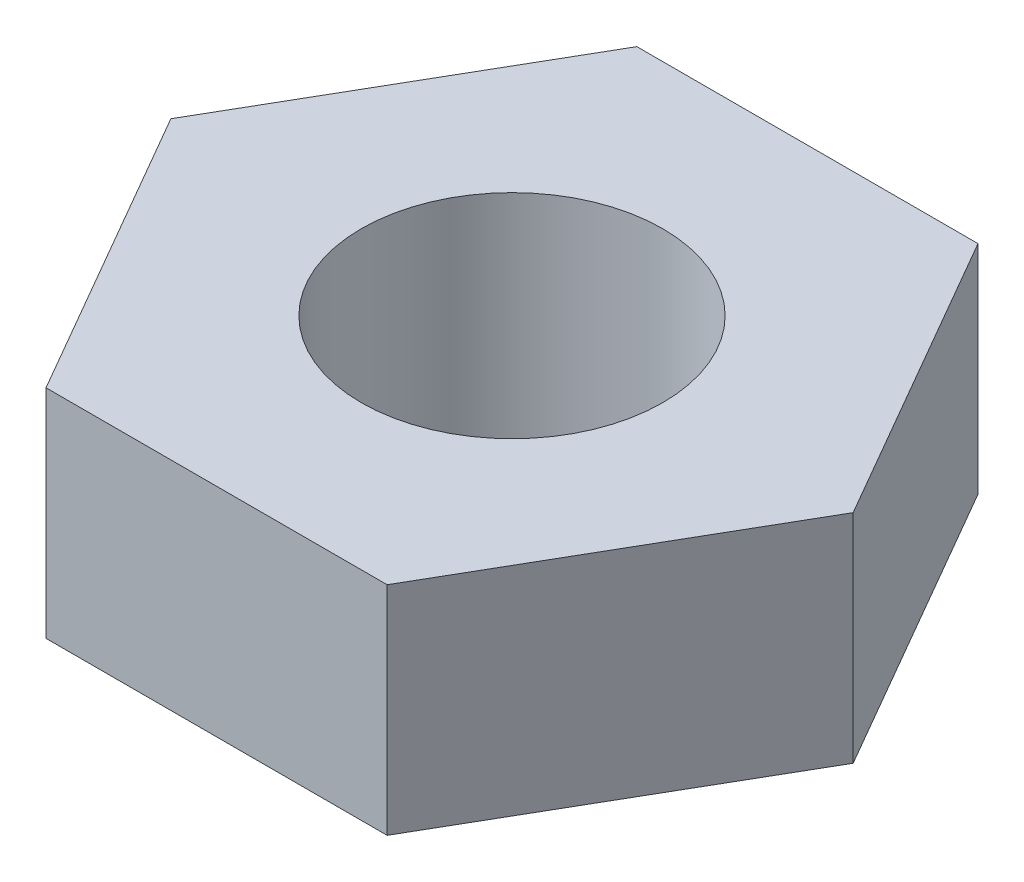
ISO-10303-21;
HEADER;
FILE_DESCRIPTION(('STEP AP214'),'2;1');
FILE_NAME('part.step','',(''),(''),'','','');
FILE_SCHEMA(('AUTOMOTIVE_DESIGN { 1 0 10303 214 1 1 1 1 }'));
ENDSEC;
DATA;
#1=APPLICATION_CONTEXT('core data for automotive mechanical design processes');
#2=APPLICATION_PROTOCOL_DEFINITION('international standard','automotive_design',2000,#1);
#3=PRODUCT_CONTEXT('',#1,'mechanical');
#4=PRODUCT('Part','Part','',(#3));
#5=PRODUCT_RELATED_PRODUCT_CATEGORY('part','',(#4));
#6=PRODUCT_DEFINITION_FORMATION('','',#4);
#7=PRODUCT_DEFINITION_CONTEXT('part definition',#1,'design');
#8=PRODUCT_DEFINITION('design','',#6,#7);
#9=PRODUCT_DEFINITION_SHAPE('','',#8);
#10=(LENGTH_UNIT() NAMED_UNIT(*) SI_UNIT(.MILLI.,.METRE.));
#11=(NAMED_UNIT(*) PLANE_ANGLE_UNIT() SI_UNIT($,.RADIAN.));
#12=(NAMED_UNIT(*) SI_UNIT($,.STERADIAN.) SOLID_ANGLE_UNIT());
#13=UNCERTAINTY_MEASURE_WITH_UNIT(LENGTH_MEASURE(1.E-05),#10,'distance_accuracy_value','');
#14=(GEOMETRIC_REPRESENTATION_CONTEXT(3) GLOBAL_UNCERTAINTY_ASSIGNED_CONTEXT((#13)) GLOBAL_UNIT_ASSIGNED_CONTEXT((#10,
#11,#12)) REPRESENTATION_CONTEXT('',''));
#15=CARTESIAN_POINT('',(0.,0.,0.));
#16=DIRECTION('',(0.,0.,1.));
#17=DIRECTION('',(1.,0.,0.));
#18=AXIS2_PLACEMENT_3D('',#15,#16,#17);
#19=CARTESIAN_POINT('',(0.,1.8,2.45));
#20=DIRECTION('',(0.,0.,-1.));
#21=DIRECTION('',(-1.,0.,0.));
#22=AXIS2_PLACEMENT_3D('',#19,#20,#21);
#23=PLANE('',#22);
#24=DIRECTION('',(1.,0.,0.));
#25=VECTOR('',#24,1.);
#26=CARTESIAN_POINT('',(0.,0.,2.45));
#27=LINE('',#26,#25);
#28=CARTESIAN_POINT('',(-1.41450815951458,0.,2.45));
#29=VERTEX_POINT('',#28);
#30=CARTESIAN_POINT('',(1.41450815951458,0.,2.45));
#31=VERTEX_POINT('',#30);
#32=EDGE_CURVE('E129',#29,#31,#27,.T.);
#33=ORIENTED_EDGE('',*,*,#32,.T.);
#34=DIRECTION('',(0.,-1.,0.));
#35=VECTOR('',#34,1.);
#36=CARTESIAN_POINT('',(1.41450815951458,1.8,2.45));
#37=LINE('',#36,#35);
#38=CARTESIAN_POINT('',(1.41450815951458,1.8,2.45));
#39=VERTEX_POINT('',#38);
#40=EDGE_CURVE('E11',#39,#31,#37,.T.);
#41=ORIENTED_EDGE('',*,*,#40,.F.);
#42=DIRECTION('',(1.,0.,0.));
#43=VECTOR('',#42,1.);
#44=CARTESIAN_POINT('',(0.,1.8,2.45));
#45=LINE('',#44,#43);
#46=CARTESIAN_POINT('',(-1.41450815951458,1.8,2.45));
#47=VERTEX_POINT('',#46);
#48=EDGE_CURVE('E152',#47,#39,#45,.T.);
#49=ORIENTED_EDGE('',*,*,#48,.F.);
#50=DIRECTION('',(0.,-1.,0.));
#51=VECTOR('',#50,1.);
#52=CARTESIAN_POINT('',(-1.41450815951458,1.8,2.45));
#53=LINE('',#52,#51);
#54=EDGE_CURVE('E122',#47,#29,#53,.T.);
#55=ORIENTED_EDGE('',*,*,#54,.T.);
#56=EDGE_LOOP('',(#33,#41,#49,#55));
#57=FACE_BOUND('',#56,.T.);
#58=ADVANCED_FACE('F41',(#57),#23,.F.);
#59=CARTESIAN_POINT('',(2.12176223927188,1.8,1.225));
#60=DIRECTION('',(-0.866025403784438,0.,-0.5));
#61=DIRECTION('',(-0.5,0.,0.866025403784439));
#62=AXIS2_PLACEMENT_3D('',#59,#60,#61);
#63=PLANE('',#62);
#64=DIRECTION('',(0.5,0.,-0.866025403784439));
#65=VECTOR('',#64,1.);
#66=CARTESIAN_POINT('',(2.12176223927188,0.,1.225));
#67=LINE('',#66,#65);
#68=CARTESIAN_POINT('',(2.82901631902917,0.,0.));
#69=VERTEX_POINT('',#68);
#70=EDGE_CURVE('E132',#31,#69,#67,.T.);
#71=ORIENTED_EDGE('',*,*,#70,.T.);
#72=DIRECTION('',(0.,-1.,0.));
#73=VECTOR('',#72,1.);
#74=CARTESIAN_POINT('',(2.82901631902917,1.8,0.));
#75=LINE('',#74,#73);
#76=CARTESIAN_POINT('',(2.82901631902917,1.8,0.));
#77=VERTEX_POINT('',#76);
#78=EDGE_CURVE('E50',#77,#69,#75,.T.);
#79=ORIENTED_EDGE('',*,*,#78,.F.);
#80=DIRECTION('',(0.5,0.,-0.866025403784439));
#81=VECTOR('',#80,1.);
#82=CARTESIAN_POINT('',(2.12176223927188,1.8,1.225));
#83=LINE('',#82,#81);
#84=EDGE_CURVE('E95',#39,#77,#83,.T.);
#85=ORIENTED_EDGE('',*,*,#84,.F.);
#86=ORIENTED_EDGE('',*,*,#40,.T.);
#87=EDGE_LOOP('',(#71,#79,#85,#86));
#88=FACE_BOUND('',#87,.T.);
#89=ADVANCED_FACE('F166',(#88),#63,.F.);
#90=CARTESIAN_POINT('',(2.12176223927188,1.8,-1.225));
#91=DIRECTION('',(-0.866025403784439,0.,0.5));
#92=DIRECTION('',(0.5,0.,0.866025403784439));
#93=AXIS2_PLACEMENT_3D('',#90,#91,#92);
#94=PLANE('',#93);
#95=DIRECTION('',(-0.5,0.,-0.866025403784439));
#96=VECTOR('',#95,1.);
#97=CARTESIAN_POINT('',(2.12176223927188,0.,-1.225));
#98=LINE('',#97,#96);
#99=CARTESIAN_POINT('',(1.41450815951458,0.,-2.45));
#100=VERTEX_POINT('',#99);
#101=EDGE_CURVE('E134',#69,#100,#98,.T.);
#102=ORIENTED_EDGE('',*,*,#101,.T.);
#103=DIRECTION('',(0.,-1.,0.));
#104=VECTOR('',#103,1.);
#105=CARTESIAN_POINT('',(1.41450815951458,1.8,-2.45));
#106=LINE('',#105,#104);
#107=CARTESIAN_POINT('',(1.41450815951458,1.8,-2.45));
#108=VERTEX_POINT('',#107);
#109=EDGE_CURVE('E117',#108,#100,#106,.T.);
#110=ORIENTED_EDGE('',*,*,#109,.F.);
#111=DIRECTION('',(-0.5,0.,-0.866025403784439));
#112=VECTOR('',#111,1.);
#113=CARTESIAN_POINT('',(2.12176223927188,1.8,-1.225));
#114=LINE('',#113,#112);
#115=EDGE_CURVE('E108',#77,#108,#114,.T.);
#116=ORIENTED_EDGE('',*,*,#115,.F.);
#117=ORIENTED_EDGE('',*,*,#78,.T.);
#118=EDGE_LOOP('',(#102,#110,#116,#117));
#119=FACE_BOUND('',#118,.T.);
#120=ADVANCED_FACE('F145',(#119),#94,.F.);
#121=CARTESIAN_POINT('',(0.,1.8,-2.45));
#122=DIRECTION('',(0.,0.,1.));
#123=DIRECTION('',(1.,0.,0.));
#124=AXIS2_PLACEMENT_3D('',#121,#122,#123);
#125=PLANE('',#124);
#126=DIRECTION('',(-1.,0.,0.));
#127=VECTOR('',#126,1.);
#128=CARTESIAN_POINT('',(0.,0.,-2.45));
#129=LINE('',#128,#127);
#130=CARTESIAN_POINT('',(-1.41450815951458,0.,-2.45));
#131=VERTEX_POINT('',#130);
#132=EDGE_CURVE('E116',#100,#131,#129,.T.);
#133=ORIENTED_EDGE('',*,*,#132,.T.);
#134=DIRECTION('',(0.,-1.,0.));
#135=VECTOR('',#134,1.);
#136=CARTESIAN_POINT('',(-1.41450815951458,1.8,-2.45));
#137=LINE('',#136,#135);
#138=CARTESIAN_POINT('',(-1.41450815951458,1.8,-2.45));
#139=VERTEX_POINT('',#138);
#140=EDGE_CURVE('E113',#139,#131,#137,.T.);
#141=ORIENTED_EDGE('',*,*,#140,.F.);
#142=DIRECTION('',(-1.,0.,0.));
#143=VECTOR('',#142,1.);
#144=CARTESIAN_POINT('',(0.,1.8,-2.45));
#145=LINE('',#144,#143);
#146=EDGE_CURVE('E102',#108,#139,#145,.T.);
#147=ORIENTED_EDGE('',*,*,#146,.F.);
#148=ORIENTED_EDGE('',*,*,#109,.T.);
#149=EDGE_LOOP('',(#133,#141,#147,#148));
#150=FACE_BOUND('',#149,.T.);
#151=ADVANCED_FACE('F114',(#150),#125,.F.);
#152=CARTESIAN_POINT('',(-2.12176223927187,1.8,-1.225));
#153=DIRECTION('',(0.866025403784438,0.,0.5));
#154=DIRECTION('',(0.5,0.,-0.866025403784439));
#155=AXIS2_PLACEMENT_3D('',#152,#153,#154);
#156=PLANE('',#155);
#157=DIRECTION('',(-0.5,0.,0.866025403784439));
#158=VECTOR('',#157,1.);
#159=CARTESIAN_POINT('',(-2.12176223927187,0.,-1.225));
#160=LINE('',#159,#158);
#161=CARTESIAN_POINT('',(-2.82901631902917,0.,0.));
#162=VERTEX_POINT('',#161);
#163=EDGE_CURVE('E81',#131,#162,#160,.T.);
#164=ORIENTED_EDGE('',*,*,#163,.T.);
#165=DIRECTION('',(0.,-1.,0.));
#166=VECTOR('',#165,1.);
#167=CARTESIAN_POINT('',(-2.82901631902917,1.8,0.));
#168=LINE('',#167,#166);
#169=CARTESIAN_POINT('',(-2.82901631902917,1.8,0.));
#170=VERTEX_POINT('',#169);
#171=EDGE_CURVE('E118',#170,#162,#168,.T.);
#172=ORIENTED_EDGE('',*,*,#171,.F.);
#173=DIRECTION('',(-0.5,0.,0.866025403784439));
#174=VECTOR('',#173,1.);
#175=CARTESIAN_POINT('',(-2.12176223927187,1.8,-1.225));
#176=LINE('',#175,#174);
#177=EDGE_CURVE('E106',#139,#170,#176,.T.);
#178=ORIENTED_EDGE('',*,*,#177,.F.);
#179=ORIENTED_EDGE('',*,*,#140,.T.);
#180=EDGE_LOOP('',(#164,#172,#178,#179));
#181=FACE_BOUND('',#180,.T.);
#182=ADVANCED_FACE('F120',(#181),#156,.F.);
#183=CARTESIAN_POINT('',(0.,1.8,0.));
#184=DIRECTION('',(0.,-1.,0.));
#185=DIRECTION('',(0.,0.,-1.));
#186=AXIS2_PLACEMENT_3D('',#183,#184,#185);
#187=CYLINDRICAL_SURFACE('',#186,1.25);
#188=CARTESIAN_POINT('',(0.,1.8,0.));
#189=DIRECTION('',(0.,1.,0.));
#190=DIRECTION('',(0.,0.,1.));
#191=AXIS2_PLACEMENT_3D('',#188,#189,#190);
#192=CIRCLE('',#191,1.25);
#193=CARTESIAN_POINT('',(0.,1.8,1.25));
#194=VERTEX_POINT('',#193);
#195=EDGE_CURVE('E139',#194,#194,#192,.T.);
#196=ORIENTED_EDGE('',*,*,#195,.T.);
#197=EDGE_LOOP('',(#196));
#198=FACE_BOUND('',#197,.T.);
#199=CARTESIAN_POINT('',(0.,0.,0.));
#200=DIRECTION('',(0.,1.,0.));
#201=DIRECTION('',(0.,0.,1.));
#202=AXIS2_PLACEMENT_3D('',#199,#200,#201);
#203=CIRCLE('',#202,1.25);
#204=CARTESIAN_POINT('',(0.,0.,1.25));
#205=VERTEX_POINT('',#204);
#206=EDGE_CURVE('E126',#205,#205,#203,.T.);
#207=ORIENTED_EDGE('',*,*,#206,.F.);
#208=EDGE_LOOP('',(#207));
#209=FACE_BOUND('',#208,.T.);
#210=ADVANCED_FACE('F43',(#198,#209),#187,.F.);
#211=CARTESIAN_POINT('',(-2.12176223927188,1.8,1.225));
#212=DIRECTION('',(0.866025403784439,0.,-0.5));
#213=DIRECTION('',(-0.5,0.,-0.866025403784439));
#214=AXIS2_PLACEMENT_3D('',#211,#212,#213);
#215=PLANE('',#214);
#216=DIRECTION('',(0.5,0.,0.866025403784439));
#217=VECTOR('',#216,1.);
#218=CARTESIAN_POINT('',(-2.12176223927188,0.,1.225));
#219=LINE('',#218,#217);
#220=EDGE_CURVE('E87',#162,#29,#219,.T.);
#221=ORIENTED_EDGE('',*,*,#220,.T.);
#222=ORIENTED_EDGE('',*,*,#54,.F.);
#223=DIRECTION('',(0.5,0.,0.866025403784439));
#224=VECTOR('',#223,1.);
#225=CARTESIAN_POINT('',(-2.12176223927188,1.8,1.225));
#226=LINE('',#225,#224);
#227=EDGE_CURVE('E58',#170,#47,#226,.T.);
#228=ORIENTED_EDGE('',*,*,#227,.F.);
#229=ORIENTED_EDGE('',*,*,#171,.T.);
#230=EDGE_LOOP('',(#221,#222,#228,#229));
#231=FACE_BOUND('',#230,.T.);
#232=ADVANCED_FACE('F153',(#231),#215,.F.);
#233=CARTESIAN_POINT('',(0.,1.8,0.));
#234=DIRECTION('',(0.,1.,0.));
#235=DIRECTION('',(0.,0.,1.));
#236=AXIS2_PLACEMENT_3D('',#233,#234,#235);
#237=PLANE('',#236);
#238=ORIENTED_EDGE('',*,*,#195,.F.);
#239=EDGE_LOOP('',(#238));
#240=FACE_BOUND('',#239,.T.);
#241=ORIENTED_EDGE('',*,*,#48,.T.);
#242=ORIENTED_EDGE('',*,*,#84,.T.);
#243=ORIENTED_EDGE('',*,*,#115,.T.);
#244=ORIENTED_EDGE('',*,*,#146,.T.);
#245=ORIENTED_EDGE('',*,*,#177,.T.);
#246=ORIENTED_EDGE('',*,*,#227,.T.);
#247=EDGE_LOOP('',(#241,#242,#243,#244,#245,#246));
#248=FACE_BOUND('',#247,.T.);
#249=ADVANCED_FACE('F104',(#240,#248),#237,.T.);
#250=CARTESIAN_POINT('',(0.,0.,0.));
#251=DIRECTION('',(0.,1.,0.));
#252=DIRECTION('',(0.,0.,1.));
#253=AXIS2_PLACEMENT_3D('',#250,#251,#252);
#254=PLANE('',#253);
#255=ORIENTED_EDGE('',*,*,#206,.T.);
#256=EDGE_LOOP('',(#255));
#257=FACE_BOUND('',#256,.T.);
#258=ORIENTED_EDGE('',*,*,#32,.F.);
#259=ORIENTED_EDGE('',*,*,#220,.F.);
#260=ORIENTED_EDGE('',*,*,#163,.F.);
#261=ORIENTED_EDGE('',*,*,#132,.F.);
#262=ORIENTED_EDGE('',*,*,#101,.F.);
#263=ORIENTED_EDGE('',*,*,#70,.F.);
#264=EDGE_LOOP('',(#258,#259,#260,#261,#262,#263));
#265=FACE_BOUND('',#264,.T.);
#266=ADVANCED_FACE('F148',(#257,#265),#254,.F.);
#267=CLOSED_SHELL('',(#58,#89,#120,#151,#182,#210,#232,#249,#266));
#268=MANIFOLD_SOLID_BREP('B2',#267);
#269=ADVANCED_BREP_SHAPE_REPRESENTATION('',(#18,#268),#14);
#270=SHAPE_DEFINITION_REPRESENTATION(#9,#269);
ENDSEC;
END-ISO-10303-21;
